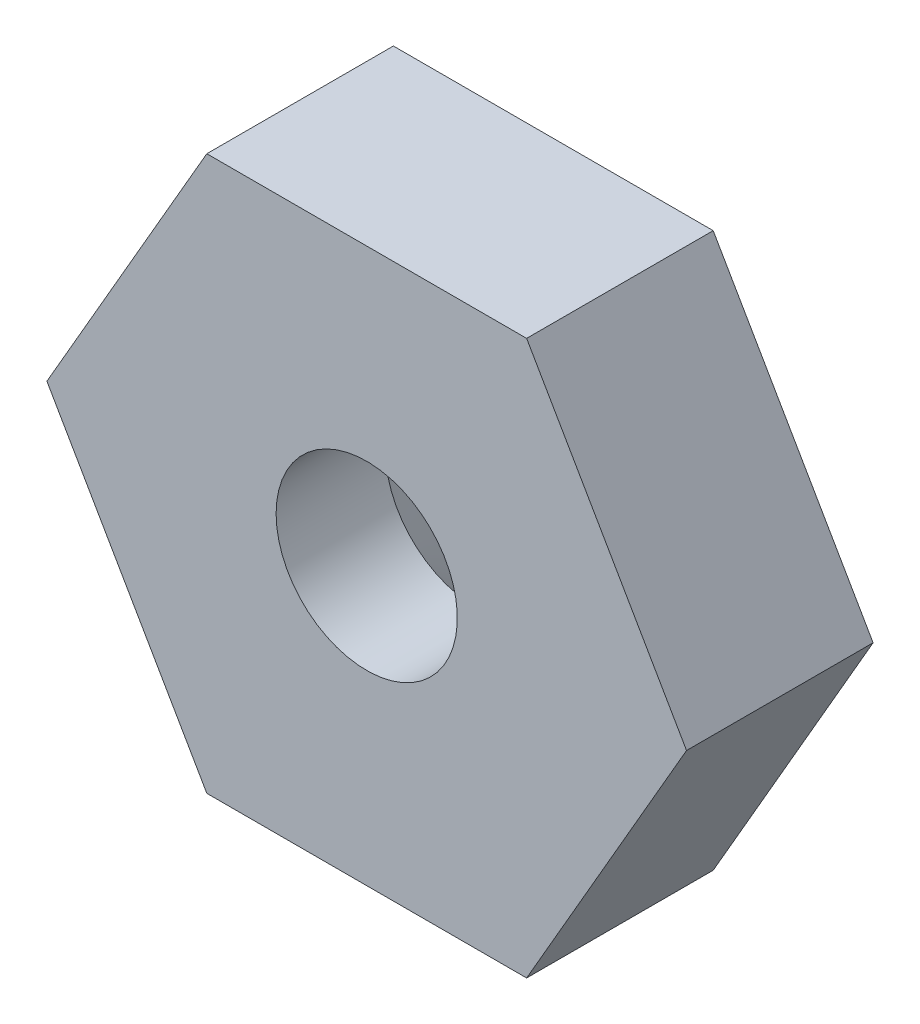
ISO-10303-21;
HEADER;
FILE_DESCRIPTION(('STEP AP214'),'2;1');
FILE_NAME('part.step','',(''),(''),'','','');
FILE_SCHEMA(('AUTOMOTIVE_DESIGN { 1 0 10303 214 1 1 1 1 }'));
ENDSEC;
DATA;
#1=APPLICATION_CONTEXT('core data for automotive mechanical design processes');
#2=APPLICATION_PROTOCOL_DEFINITION('international standard','automotive_design',2000,#1);
#3=PRODUCT_CONTEXT('',#1,'mechanical');
#4=PRODUCT('Part','Part','',(#3));
#5=PRODUCT_RELATED_PRODUCT_CATEGORY('part','',(#4));
#6=PRODUCT_DEFINITION_FORMATION('','',#4);
#7=PRODUCT_DEFINITION_CONTEXT('part definition',#1,'design');
#8=PRODUCT_DEFINITION('design','',#6,#7);
#9=PRODUCT_DEFINITION_SHAPE('','',#8);
#10=(LENGTH_UNIT() NAMED_UNIT(*) SI_UNIT(.MILLI.,.METRE.));
#11=(NAMED_UNIT(*) PLANE_ANGLE_UNIT() SI_UNIT($,.RADIAN.));
#12=(NAMED_UNIT(*) SI_UNIT($,.STERADIAN.) SOLID_ANGLE_UNIT());
#13=UNCERTAINTY_MEASURE_WITH_UNIT(LENGTH_MEASURE(1.E-05),#10,'distance_accuracy_value','');
#14=(GEOMETRIC_REPRESENTATION_CONTEXT(3) GLOBAL_UNCERTAINTY_ASSIGNED_CONTEXT((#13)) GLOBAL_UNIT_ASSIGNED_CONTEXT((#10,
#11,#12)) REPRESENTATION_CONTEXT('',''));
#15=CARTESIAN_POINT('',(0.,0.,0.));
#16=DIRECTION('',(0.,0.,1.));
#17=DIRECTION('',(1.,0.,0.));
#18=AXIS2_PLACEMENT_3D('',#15,#16,#17);
#19=CARTESIAN_POINT('',(0.,0.,-1.75));
#20=DIRECTION('',(0.,0.,1.));
#21=DIRECTION('',(1.,0.,0.));
#22=AXIS2_PLACEMENT_3D('',#19,#20,#21);
#23=PLANE('',#22);
#24=DIRECTION('',(1.,0.,0.));
#25=VECTOR('',#24,1.);
#26=CARTESIAN_POINT('',(-3.,-5.19615242270663,-1.75));
#27=LINE('',#26,#25);
#28=CARTESIAN_POINT('',(-3.,-5.19615242270663,-1.75));
#29=VERTEX_POINT('',#28);
#30=CARTESIAN_POINT('',(3.,-5.19615242270663,-1.75));
#31=VERTEX_POINT('',#30);
#32=EDGE_CURVE('E128',#29,#31,#27,.T.);
#33=ORIENTED_EDGE('',*,*,#32,.F.);
#34=DIRECTION('',(0.5,-0.866025403784439,0.));
#35=VECTOR('',#34,1.);
#36=CARTESIAN_POINT('',(-6.,0.,-1.75));
#37=LINE('',#36,#35);
#38=CARTESIAN_POINT('',(-6.,0.,-1.75));
#39=VERTEX_POINT('',#38);
#40=EDGE_CURVE('E89',#39,#29,#37,.T.);
#41=ORIENTED_EDGE('',*,*,#40,.F.);
#42=DIRECTION('',(-0.5,-0.866025403784439,0.));
#43=VECTOR('',#42,1.);
#44=CARTESIAN_POINT('',(-3.,5.19615242270663,-1.75));
#45=LINE('',#44,#43);
#46=CARTESIAN_POINT('',(-3.,5.19615242270663,-1.75));
#47=VERTEX_POINT('',#46);
#48=EDGE_CURVE('E83',#47,#39,#45,.T.);
#49=ORIENTED_EDGE('',*,*,#48,.F.);
#50=DIRECTION('',(-1.,0.,0.));
#51=VECTOR('',#50,1.);
#52=CARTESIAN_POINT('',(3.,5.19615242270663,-1.75));
#53=LINE('',#52,#51);
#54=CARTESIAN_POINT('',(3.,5.19615242270663,-1.75));
#55=VERTEX_POINT('',#54);
#56=EDGE_CURVE('E118',#55,#47,#53,.T.);
#57=ORIENTED_EDGE('',*,*,#56,.F.);
#58=DIRECTION('',(-0.5,0.866025403784439,0.));
#59=VECTOR('',#58,1.);
#60=CARTESIAN_POINT('',(6.,0.,-1.75));
#61=LINE('',#60,#59);
#62=CARTESIAN_POINT('',(6.,0.,-1.75));
#63=VERTEX_POINT('',#62);
#64=EDGE_CURVE('E134',#63,#55,#61,.T.);
#65=ORIENTED_EDGE('',*,*,#64,.F.);
#66=DIRECTION('',(0.5,0.866025403784439,0.));
#67=VECTOR('',#66,1.);
#68=CARTESIAN_POINT('',(3.,-5.19615242270663,-1.75));
#69=LINE('',#68,#67);
#70=EDGE_CURVE('E131',#31,#63,#69,.T.);
#71=ORIENTED_EDGE('',*,*,#70,.F.);
#72=EDGE_LOOP('',(#33,#41,#49,#57,#65,#71));
#73=FACE_BOUND('',#72,.T.);
#74=CARTESIAN_POINT('',(0.,0.,-1.75));
#75=DIRECTION('',(0.,0.,-1.));
#76=DIRECTION('',(-1.,0.,0.));
#77=AXIS2_PLACEMENT_3D('',#74,#75,#76);
#78=CIRCLE('',#77,3.15);
#79=CARTESIAN_POINT('',(-3.15,0.,-1.75));
#80=VERTEX_POINT('',#79);
#81=EDGE_CURVE('E184',#80,#80,#78,.T.);
#82=ORIENTED_EDGE('',*,*,#81,.F.);
#83=EDGE_LOOP('',(#82));
#84=FACE_BOUND('',#83,.T.);
#85=ADVANCED_FACE('F43',(#73,#84),#23,.F.);
#86=CARTESIAN_POINT('',(-3.,-5.19615242270663,1.75));
#87=DIRECTION('',(0.,1.,0.));
#88=DIRECTION('',(-1.,0.,0.));
#89=AXIS2_PLACEMENT_3D('',#86,#87,#88);
#90=PLANE('',#89);
#91=ORIENTED_EDGE('',*,*,#32,.T.);
#92=DIRECTION('',(0.,0.,-1.));
#93=VECTOR('',#92,1.);
#94=CARTESIAN_POINT('',(3.,-5.19615242270663,1.75));
#95=LINE('',#94,#93);
#96=CARTESIAN_POINT('',(3.,-5.19615242270663,1.75));
#97=VERTEX_POINT('',#96);
#98=EDGE_CURVE('E11',#97,#31,#95,.T.);
#99=ORIENTED_EDGE('',*,*,#98,.F.);
#100=DIRECTION('',(1.,0.,0.));
#101=VECTOR('',#100,1.);
#102=CARTESIAN_POINT('',(-3.,-5.19615242270663,1.75));
#103=LINE('',#102,#101);
#104=CARTESIAN_POINT('',(-3.,-5.19615242270663,1.75));
#105=VERTEX_POINT('',#104);
#106=EDGE_CURVE('E139',#105,#97,#103,.T.);
#107=ORIENTED_EDGE('',*,*,#106,.F.);
#108=DIRECTION('',(0.,0.,-1.));
#109=VECTOR('',#108,1.);
#110=CARTESIAN_POINT('',(-3.,-5.19615242270663,1.75));
#111=LINE('',#110,#109);
#112=EDGE_CURVE('E124',#105,#29,#111,.T.);
#113=ORIENTED_EDGE('',*,*,#112,.T.);
#114=EDGE_LOOP('',(#91,#99,#107,#113));
#115=FACE_BOUND('',#114,.T.);
#116=ADVANCED_FACE('F45',(#115),#90,.F.);
#117=CARTESIAN_POINT('',(3.,-5.19615242270663,1.75));
#118=DIRECTION('',(-0.866025403784439,0.5,0.));
#119=DIRECTION('',(-0.5,-0.866025403784439,0.));
#120=AXIS2_PLACEMENT_3D('',#117,#118,#119);
#121=PLANE('',#120);
#122=ORIENTED_EDGE('',*,*,#70,.T.);
#123=DIRECTION('',(0.,0.,-1.));
#124=VECTOR('',#123,1.);
#125=CARTESIAN_POINT('',(6.,0.,1.75));
#126=LINE('',#125,#124);
#127=CARTESIAN_POINT('',(6.,0.,1.75));
#128=VERTEX_POINT('',#127);
#129=EDGE_CURVE('E52',#128,#63,#126,.T.);
#130=ORIENTED_EDGE('',*,*,#129,.F.);
#131=DIRECTION('',(0.5,0.866025403784439,0.));
#132=VECTOR('',#131,1.);
#133=CARTESIAN_POINT('',(3.,-5.19615242270663,1.75));
#134=LINE('',#133,#132);
#135=EDGE_CURVE('E97',#97,#128,#134,.T.);
#136=ORIENTED_EDGE('',*,*,#135,.F.);
#137=ORIENTED_EDGE('',*,*,#98,.T.);
#138=EDGE_LOOP('',(#122,#130,#136,#137));
#139=FACE_BOUND('',#138,.T.);
#140=ADVANCED_FACE('F168',(#139),#121,.F.);
#141=CARTESIAN_POINT('',(6.,0.,1.75));
#142=DIRECTION('',(-0.866025403784439,-0.5,0.));
#143=DIRECTION('',(0.5,-0.866025403784439,0.));
#144=AXIS2_PLACEMENT_3D('',#141,#142,#143);
#145=PLANE('',#144);
#146=ORIENTED_EDGE('',*,*,#64,.T.);
#147=DIRECTION('',(0.,0.,-1.));
#148=VECTOR('',#147,1.);
#149=CARTESIAN_POINT('',(3.,5.19615242270663,1.75));
#150=LINE('',#149,#148);
#151=CARTESIAN_POINT('',(3.,5.19615242270663,1.75));
#152=VERTEX_POINT('',#151);
#153=EDGE_CURVE('E119',#152,#55,#150,.T.);
#154=ORIENTED_EDGE('',*,*,#153,.F.);
#155=DIRECTION('',(-0.5,0.866025403784439,0.));
#156=VECTOR('',#155,1.);
#157=CARTESIAN_POINT('',(6.,0.,1.75));
#158=LINE('',#157,#156);
#159=EDGE_CURVE('E110',#128,#152,#158,.T.);
#160=ORIENTED_EDGE('',*,*,#159,.F.);
#161=ORIENTED_EDGE('',*,*,#129,.T.);
#162=EDGE_LOOP('',(#146,#154,#160,#161));
#163=FACE_BOUND('',#162,.T.);
#164=ADVANCED_FACE('F145',(#163),#145,.F.);
#165=CARTESIAN_POINT('',(3.,5.19615242270663,1.75));
#166=DIRECTION('',(0.,-1.,0.));
#167=DIRECTION('',(1.,0.,0.));
#168=AXIS2_PLACEMENT_3D('',#165,#166,#167);
#169=PLANE('',#168);
#170=ORIENTED_EDGE('',*,*,#56,.T.);
#171=DIRECTION('',(0.,0.,-1.));
#172=VECTOR('',#171,1.);
#173=CARTESIAN_POINT('',(-3.,5.19615242270663,1.75));
#174=LINE('',#173,#172);
#175=CARTESIAN_POINT('',(-3.,5.19615242270663,1.75));
#176=VERTEX_POINT('',#175);
#177=EDGE_CURVE('E115',#176,#47,#174,.T.);
#178=ORIENTED_EDGE('',*,*,#177,.F.);
#179=DIRECTION('',(-1.,0.,0.));
#180=VECTOR('',#179,1.);
#181=CARTESIAN_POINT('',(3.,5.19615242270663,1.75));
#182=LINE('',#181,#180);
#183=EDGE_CURVE('E104',#152,#176,#182,.T.);
#184=ORIENTED_EDGE('',*,*,#183,.F.);
#185=ORIENTED_EDGE('',*,*,#153,.T.);
#186=EDGE_LOOP('',(#170,#178,#184,#185));
#187=FACE_BOUND('',#186,.T.);
#188=ADVANCED_FACE('F116',(#187),#169,.F.);
#189=CARTESIAN_POINT('',(-3.,5.19615242270663,1.75));
#190=DIRECTION('',(0.866025403784439,-0.5,0.));
#191=DIRECTION('',(0.5,0.866025403784439,0.));
#192=AXIS2_PLACEMENT_3D('',#189,#190,#191);
#193=PLANE('',#192);
#194=ORIENTED_EDGE('',*,*,#48,.T.);
#195=DIRECTION('',(0.,0.,-1.));
#196=VECTOR('',#195,1.);
#197=CARTESIAN_POINT('',(-6.,0.,1.75));
#198=LINE('',#197,#196);
#199=CARTESIAN_POINT('',(-6.,0.,1.75));
#200=VERTEX_POINT('',#199);
#201=EDGE_CURVE('E120',#200,#39,#198,.T.);
#202=ORIENTED_EDGE('',*,*,#201,.F.);
#203=DIRECTION('',(-0.5,-0.866025403784439,0.));
#204=VECTOR('',#203,1.);
#205=CARTESIAN_POINT('',(-3.,5.19615242270663,1.75));
#206=LINE('',#205,#204);
#207=EDGE_CURVE('E108',#176,#200,#206,.T.);
#208=ORIENTED_EDGE('',*,*,#207,.F.);
#209=ORIENTED_EDGE('',*,*,#177,.T.);
#210=EDGE_LOOP('',(#194,#202,#208,#209));
#211=FACE_BOUND('',#210,.T.);
#212=ADVANCED_FACE('F122',(#211),#193,.F.);
#213=CARTESIAN_POINT('',(-6.,0.,1.75));
#214=DIRECTION('',(0.866025403784439,0.5,0.));
#215=DIRECTION('',(-0.5,0.866025403784439,0.));
#216=AXIS2_PLACEMENT_3D('',#213,#214,#215);
#217=PLANE('',#216);
#218=ORIENTED_EDGE('',*,*,#40,.T.);
#219=ORIENTED_EDGE('',*,*,#112,.F.);
#220=DIRECTION('',(0.5,-0.866025403784439,0.));
#221=VECTOR('',#220,1.);
#222=CARTESIAN_POINT('',(-6.,0.,1.75));
#223=LINE('',#222,#221);
#224=EDGE_CURVE('E60',#200,#105,#223,.T.);
#225=ORIENTED_EDGE('',*,*,#224,.F.);
#226=ORIENTED_EDGE('',*,*,#201,.T.);
#227=EDGE_LOOP('',(#218,#219,#225,#226));
#228=FACE_BOUND('',#227,.T.);
#229=ADVANCED_FACE('F152',(#228),#217,.F.);
#230=CARTESIAN_POINT('',(0.,0.,1.75));
#231=DIRECTION('',(0.,0.,1.));
#232=DIRECTION('',(1.,0.,0.));
#233=AXIS2_PLACEMENT_3D('',#230,#231,#232);
#234=PLANE('',#233);
#235=CARTESIAN_POINT('',(0.,0.,1.75));
#236=DIRECTION('',(0.,0.,-1.));
#237=DIRECTION('',(-1.,0.,0.));
#238=AXIS2_PLACEMENT_3D('',#235,#236,#237);
#239=CIRCLE('',#238,1.7);
#240=CARTESIAN_POINT('',(-1.7,0.,1.75));
#241=VERTEX_POINT('',#240);
#242=EDGE_CURVE('E132',#241,#241,#239,.T.);
#243=ORIENTED_EDGE('',*,*,#242,.T.);
#244=EDGE_LOOP('',(#243));
#245=FACE_BOUND('',#244,.T.);
#246=ORIENTED_EDGE('',*,*,#106,.T.);
#247=ORIENTED_EDGE('',*,*,#135,.T.);
#248=ORIENTED_EDGE('',*,*,#159,.T.);
#249=ORIENTED_EDGE('',*,*,#183,.T.);
#250=ORIENTED_EDGE('',*,*,#207,.T.);
#251=ORIENTED_EDGE('',*,*,#224,.T.);
#252=EDGE_LOOP('',(#246,#247,#248,#249,#250,#251));
#253=FACE_BOUND('',#252,.T.);
#254=ADVANCED_FACE('F106',(#245,#253),#234,.T.);
#255=CARTESIAN_POINT('',(0.,0.,-1.75));
#256=DIRECTION('',(0.,0.,-1.));
#257=DIRECTION('',(-1.,0.,0.));
#258=AXIS2_PLACEMENT_3D('',#255,#256,#257);
#259=CYLINDRICAL_SURFACE('',#258,1.69999999999999);
#260=ORIENTED_EDGE('',*,*,#242,.F.);
#261=EDGE_LOOP('',(#260));
#262=FACE_BOUND('',#261,.T.);
#263=CARTESIAN_POINT('',(0.,0.,-0.299999999999993));
#264=DIRECTION('',(0.,0.,-1.));
#265=DIRECTION('',(-1.,0.,0.));
#266=AXIS2_PLACEMENT_3D('',#263,#264,#265);
#267=CIRCLE('',#266,1.69999999999999);
#268=CARTESIAN_POINT('',(-1.69999999999999,0.,-0.299999999999993));
#269=VERTEX_POINT('',#268);
#270=EDGE_CURVE('E181',#269,#269,#267,.T.);
#271=ORIENTED_EDGE('',*,*,#270,.T.);
#272=EDGE_LOOP('',(#271));
#273=FACE_BOUND('',#272,.T.);
#274=ADVANCED_FACE('F160',(#262,#273),#259,.F.);
#275=CARTESIAN_POINT('',(0.,0.,-1.75));
#276=DIRECTION('',(0.,0.,-1.));
#277=DIRECTION('',(-1.,0.,0.));
#278=AXIS2_PLACEMENT_3D('',#275,#276,#277);
#279=CONICAL_SURFACE('',#278,3.15,0.78539816339745);
#280=ORIENTED_EDGE('',*,*,#270,.F.);
#281=EDGE_LOOP('',(#280));
#282=FACE_BOUND('',#281,.T.);
#283=ORIENTED_EDGE('',*,*,#81,.T.);
#284=EDGE_LOOP('',(#283));
#285=FACE_BOUND('',#284,.T.);
#286=ADVANCED_FACE('F172',(#282,#285),#279,.F.);
#287=CLOSED_SHELL('',(#85,#116,#140,#164,#188,#212,#229,#254,#274,#286));
#288=MANIFOLD_SOLID_BREP('B2',#287);
#289=ADVANCED_BREP_SHAPE_REPRESENTATION('',(#18,#288),#14);
#290=SHAPE_DEFINITION_REPRESENTATION(#9,#289);
ENDSEC;
END-ISO-10303-21;
